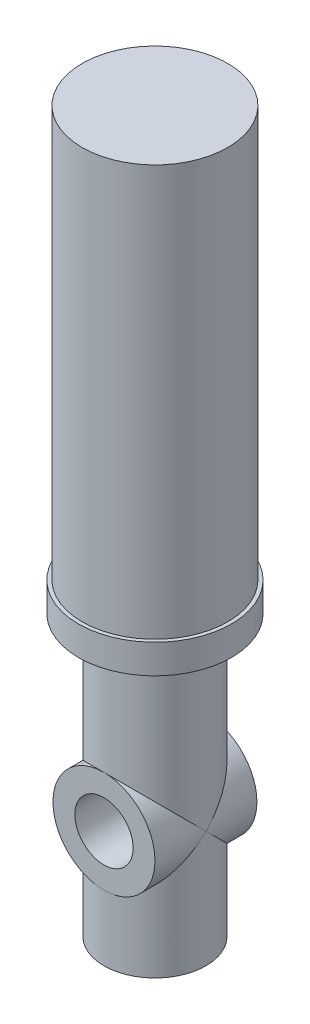
ISO-10303-21;
HEADER;
FILE_DESCRIPTION(('STEP AP214'),'2;1');
FILE_NAME('part.step','',(''),(''),'','','');
FILE_SCHEMA(('AUTOMOTIVE_DESIGN { 1 0 10303 214 1 1 1 1 }'));
ENDSEC;
DATA;
#1=APPLICATION_CONTEXT('core data for automotive mechanical design processes');
#2=APPLICATION_PROTOCOL_DEFINITION('international standard','automotive_design',2000,#1);
#3=PRODUCT_CONTEXT('',#1,'mechanical');
#4=PRODUCT('Part','Part','',(#3));
#5=PRODUCT_RELATED_PRODUCT_CATEGORY('part','',(#4));
#6=PRODUCT_DEFINITION_FORMATION('','',#4);
#7=PRODUCT_DEFINITION_CONTEXT('part definition',#1,'design');
#8=PRODUCT_DEFINITION('design','',#6,#7);
#9=PRODUCT_DEFINITION_SHAPE('','',#8);
#10=(LENGTH_UNIT() NAMED_UNIT(*) SI_UNIT(.MILLI.,.METRE.));
#11=(NAMED_UNIT(*) PLANE_ANGLE_UNIT() SI_UNIT($,.RADIAN.));
#12=(NAMED_UNIT(*) SI_UNIT($,.STERADIAN.) SOLID_ANGLE_UNIT());
#13=UNCERTAINTY_MEASURE_WITH_UNIT(LENGTH_MEASURE(1.E-05),#10,'distance_accuracy_value','');
#14=(GEOMETRIC_REPRESENTATION_CONTEXT(3) GLOBAL_UNCERTAINTY_ASSIGNED_CONTEXT((#13)) GLOBAL_UNIT_ASSIGNED_CONTEXT((#10,
#11,#12)) REPRESENTATION_CONTEXT('',''));
#15=CARTESIAN_POINT('',(0.,0.,0.));
#16=DIRECTION('',(0.,0.,1.));
#17=DIRECTION('',(1.,0.,0.));
#18=AXIS2_PLACEMENT_3D('',#15,#16,#17);
#19=CARTESIAN_POINT('',(0.,132.,0.));
#20=DIRECTION('',(0.,1.,0.));
#21=DIRECTION('',(0.,0.,1.));
#22=AXIS2_PLACEMENT_3D('',#19,#20,#21);
#23=PLANE('',#22);
#24=CARTESIAN_POINT('',(0.,132.,0.));
#25=DIRECTION('',(0.,1.,0.));
#26=DIRECTION('',(0.,0.,1.));
#27=AXIS2_PLACEMENT_3D('',#24,#25,#26);
#28=CIRCLE('',#27,52.5);
#29=CARTESIAN_POINT('',(0.,132.,52.5));
#30=VERTEX_POINT('',#29);
#31=EDGE_CURVE('E94',#30,#30,#28,.T.);
#32=ORIENTED_EDGE('',*,*,#31,.T.);
#33=EDGE_LOOP('',(#32));
#34=FACE_BOUND('',#33,.T.);
#35=CARTESIAN_POINT('',(0.,132.,0.));
#36=DIRECTION('',(0.,1.,0.));
#37=DIRECTION('',(0.,0.,1.));
#38=AXIS2_PLACEMENT_3D('',#35,#36,#37);
#39=CIRCLE('',#38,50.);
#40=CARTESIAN_POINT('',(0.,132.,50.));
#41=VERTEX_POINT('',#40);
#42=EDGE_CURVE('E113',#41,#41,#39,.T.);
#43=ORIENTED_EDGE('',*,*,#42,.F.);
#44=EDGE_LOOP('',(#43));
#45=FACE_BOUND('',#44,.T.);
#46=ADVANCED_FACE('F33',(#34,#45),#23,.T.);
#47=CARTESIAN_POINT('',(0.,-80.,0.));
#48=DIRECTION('',(0.,1.,0.));
#49=DIRECTION('',(0.,0.,1.));
#50=AXIS2_PLACEMENT_3D('',#47,#48,#49);
#51=CYLINDRICAL_SURFACE('',#50,35.);
#52=CARTESIAN_POINT('',(0.,0.,0.));
#53=DIRECTION('',(0.,0.707106781186547,-0.707106781186547));
#54=DIRECTION('',(0.,0.707106781186547,0.707106781186547));
#55=AXIS2_PLACEMENT_3D('',#52,#53,#54);
#56=ELLIPSE('',#55,49.4974746830583,35.);
#57=CARTESIAN_POINT('',(35.,0.,0.));
#58=VERTEX_POINT('',#57);
#59=CARTESIAN_POINT('',(0.,35.,35.));
#60=VERTEX_POINT('',#59);
#61=EDGE_CURVE('E11',#58,#60,#56,.F.);
#62=ORIENTED_EDGE('',*,*,#61,.F.);
#63=CARTESIAN_POINT('',(0.,0.,0.));
#64=DIRECTION('',(0.,0.707106781186547,0.707106781186547));
#65=DIRECTION('',(0.,0.707106781186547,-0.707106781186547));
#66=AXIS2_PLACEMENT_3D('',#63,#64,#65);
#67=ELLIPSE('',#66,49.4974746830583,35.);
#68=CARTESIAN_POINT('',(0.,35.,-35.));
#69=VERTEX_POINT('',#68);
#70=EDGE_CURVE('E57',#69,#58,#67,.F.);
#71=ORIENTED_EDGE('',*,*,#70,.F.);
#72=CARTESIAN_POINT('',(-35.,0.,0.));
#73=VERTEX_POINT('',#72);
#74=EDGE_CURVE('E42',#73,#69,#67,.F.);
#75=ORIENTED_EDGE('',*,*,#74,.F.);
#76=EDGE_CURVE('E44',#60,#73,#56,.F.);
#77=ORIENTED_EDGE('',*,*,#76,.F.);
#78=EDGE_LOOP('',(#62,#71,#75,#77));
#79=FACE_BOUND('',#78,.T.);
#80=CARTESIAN_POINT('',(0.,112.,0.));
#81=DIRECTION('',(0.,1.,0.));
#82=DIRECTION('',(0.,0.,1.));
#83=AXIS2_PLACEMENT_3D('',#80,#81,#82);
#84=CIRCLE('',#83,35.);
#85=CARTESIAN_POINT('',(0.,112.,35.));
#86=VERTEX_POINT('',#85);
#87=EDGE_CURVE('E85',#86,#86,#84,.F.);
#88=ORIENTED_EDGE('',*,*,#87,.T.);
#89=EDGE_LOOP('',(#88));
#90=FACE_BOUND('',#89,.T.);
#91=ADVANCED_FACE('F69',(#79,#90),#51,.T.);
#92=CARTESIAN_POINT('',(0.,0.,0.));
#93=DIRECTION('',(0.,0.707106781186547,0.707106781186547));
#94=DIRECTION('',(0.,0.707106781186547,-0.707106781186547));
#95=AXIS2_PLACEMENT_3D('',#92,#93,#94);
#96=ELLIPSE('',#95,49.4974746830583,35.);
#97=CARTESIAN_POINT('',(0.,-35.,35.));
#98=VERTEX_POINT('',#97);
#99=EDGE_CURVE('E88',#73,#98,#96,.T.);
#100=ORIENTED_EDGE('',*,*,#99,.F.);
#101=CARTESIAN_POINT('',(0.,0.,0.));
#102=DIRECTION('',(0.,0.707106781186547,-0.707106781186547));
#103=DIRECTION('',(0.,0.707106781186547,0.707106781186547));
#104=AXIS2_PLACEMENT_3D('',#101,#102,#103);
#105=ELLIPSE('',#104,49.4974746830583,35.);
#106=CARTESIAN_POINT('',(0.,-35.,-35.));
#107=VERTEX_POINT('',#106);
#108=EDGE_CURVE('E73',#107,#73,#105,.T.);
#109=ORIENTED_EDGE('',*,*,#108,.F.);
#110=EDGE_CURVE('E102',#58,#107,#105,.T.);
#111=ORIENTED_EDGE('',*,*,#110,.F.);
#112=EDGE_CURVE('E81',#98,#58,#96,.T.);
#113=ORIENTED_EDGE('',*,*,#112,.F.);
#114=EDGE_LOOP('',(#100,#109,#111,#113));
#115=FACE_BOUND('',#114,.T.);
#116=CARTESIAN_POINT('',(0.,-80.,0.));
#117=DIRECTION('',(0.,1.,0.));
#118=DIRECTION('',(0.,0.,1.));
#119=AXIS2_PLACEMENT_3D('',#116,#117,#118);
#120=CIRCLE('',#119,35.);
#121=CARTESIAN_POINT('',(0.,-80.,35.));
#122=VERTEX_POINT('',#121);
#123=EDGE_CURVE('E74',#122,#122,#120,.T.);
#124=ORIENTED_EDGE('',*,*,#123,.T.);
#125=EDGE_LOOP('',(#124));
#126=FACE_BOUND('',#125,.T.);
#127=ADVANCED_FACE('F35',(#115,#126),#51,.T.);
#128=CARTESIAN_POINT('',(0.,-80.,0.));
#129=DIRECTION('',(0.,1.,0.));
#130=DIRECTION('',(0.,0.,1.));
#131=AXIS2_PLACEMENT_3D('',#128,#129,#130);
#132=PLANE('',#131);
#133=ORIENTED_EDGE('',*,*,#123,.F.);
#134=EDGE_LOOP('',(#133));
#135=FACE_BOUND('',#134,.T.);
#136=ADVANCED_FACE('F148',(#135),#132,.F.);
#137=CARTESIAN_POINT('',(0.,0.,35.));
#138=DIRECTION('',(0.,0.,1.));
#139=DIRECTION('',(1.,0.,0.));
#140=AXIS2_PLACEMENT_3D('',#137,#138,#139);
#141=PLANE('',#140);
#142=CARTESIAN_POINT('',(0.,0.,35.));
#143=DIRECTION('',(0.,0.,1.));
#144=DIRECTION('',(1.,0.,0.));
#145=AXIS2_PLACEMENT_3D('',#142,#143,#144);
#146=CIRCLE('',#145,20.);
#147=CARTESIAN_POINT('',(20.,0.,35.));
#148=VERTEX_POINT('',#147);
#149=EDGE_CURVE('E116',#148,#148,#146,.T.);
#150=ORIENTED_EDGE('',*,*,#149,.F.);
#151=EDGE_LOOP('',(#150));
#152=FACE_BOUND('',#151,.T.);
#153=CARTESIAN_POINT('',(0.,0.,35.));
#154=DIRECTION('',(0.,0.,1.));
#155=DIRECTION('',(1.,0.,0.));
#156=AXIS2_PLACEMENT_3D('',#153,#154,#155);
#157=CIRCLE('',#156,35.);
#158=EDGE_CURVE('E84',#60,#98,#157,.T.);
#159=ORIENTED_EDGE('',*,*,#158,.T.);
#160=EDGE_CURVE('E79',#98,#60,#157,.T.);
#161=ORIENTED_EDGE('',*,*,#160,.T.);
#162=EDGE_LOOP('',(#159,#161));
#163=FACE_BOUND('',#162,.T.);
#164=ADVANCED_FACE('F83',(#152,#163),#141,.T.);
#165=CARTESIAN_POINT('',(0.,0.,-35.));
#166=DIRECTION('',(0.,0.,1.));
#167=DIRECTION('',(1.,0.,0.));
#168=AXIS2_PLACEMENT_3D('',#165,#166,#167);
#169=CYLINDRICAL_SURFACE('',#168,35.);
#170=ORIENTED_EDGE('',*,*,#76,.T.);
#171=ORIENTED_EDGE('',*,*,#99,.T.);
#172=ORIENTED_EDGE('',*,*,#158,.F.);
#173=EDGE_LOOP('',(#170,#171,#172));
#174=FACE_BOUND('',#173,.T.);
#175=ADVANCED_FACE('F87',(#174),#169,.T.);
#176=ORIENTED_EDGE('',*,*,#160,.F.);
#177=ORIENTED_EDGE('',*,*,#112,.T.);
#178=ORIENTED_EDGE('',*,*,#61,.T.);
#179=EDGE_LOOP('',(#176,#177,#178));
#180=FACE_BOUND('',#179,.T.);
#181=ADVANCED_FACE('F78',(#180),#169,.T.);
#182=CARTESIAN_POINT('',(0.,0.,-35.));
#183=DIRECTION('',(0.,0.,1.));
#184=DIRECTION('',(1.,0.,0.));
#185=AXIS2_PLACEMENT_3D('',#182,#183,#184);
#186=CIRCLE('',#185,35.);
#187=EDGE_CURVE('E89',#107,#69,#186,.T.);
#188=ORIENTED_EDGE('',*,*,#187,.T.);
#189=ORIENTED_EDGE('',*,*,#70,.T.);
#190=ORIENTED_EDGE('',*,*,#110,.T.);
#191=EDGE_LOOP('',(#188,#189,#190));
#192=FACE_BOUND('',#191,.T.);
#193=ADVANCED_FACE('F167',(#192),#169,.T.);
#194=CARTESIAN_POINT('',(0.,0.,-35.));
#195=DIRECTION('',(0.,0.,1.));
#196=DIRECTION('',(1.,0.,0.));
#197=AXIS2_PLACEMENT_3D('',#194,#195,#196);
#198=PLANE('',#197);
#199=CARTESIAN_POINT('',(0.,0.,-35.));
#200=DIRECTION('',(0.,0.,1.));
#201=DIRECTION('',(1.,0.,0.));
#202=AXIS2_PLACEMENT_3D('',#199,#200,#201);
#203=CIRCLE('',#202,20.);
#204=CARTESIAN_POINT('',(20.,0.,-35.));
#205=VERTEX_POINT('',#204);
#206=EDGE_CURVE('E37',#205,#205,#203,.T.);
#207=ORIENTED_EDGE('',*,*,#206,.T.);
#208=EDGE_LOOP('',(#207));
#209=FACE_BOUND('',#208,.T.);
#210=EDGE_CURVE('E91',#69,#107,#186,.T.);
#211=ORIENTED_EDGE('',*,*,#210,.F.);
#212=ORIENTED_EDGE('',*,*,#187,.F.);
#213=EDGE_LOOP('',(#211,#212));
#214=FACE_BOUND('',#213,.T.);
#215=ADVANCED_FACE('F125',(#209,#214),#198,.F.);
#216=ORIENTED_EDGE('',*,*,#108,.T.);
#217=ORIENTED_EDGE('',*,*,#74,.T.);
#218=ORIENTED_EDGE('',*,*,#210,.T.);
#219=EDGE_LOOP('',(#216,#217,#218));
#220=FACE_BOUND('',#219,.T.);
#221=ADVANCED_FACE('F146',(#220),#169,.T.);
#222=CARTESIAN_POINT('',(0.,112.,0.));
#223=DIRECTION('',(0.,1.,0.));
#224=DIRECTION('',(0.,0.,1.));
#225=AXIS2_PLACEMENT_3D('',#222,#223,#224);
#226=CYLINDRICAL_SURFACE('',#225,52.5);
#227=CARTESIAN_POINT('',(0.,112.,0.));
#228=DIRECTION('',(0.,1.,0.));
#229=DIRECTION('',(0.,0.,1.));
#230=AXIS2_PLACEMENT_3D('',#227,#228,#229);
#231=CIRCLE('',#230,52.5);
#232=CARTESIAN_POINT('',(0.,112.,52.5));
#233=VERTEX_POINT('',#232);
#234=EDGE_CURVE('E105',#233,#233,#231,.T.);
#235=ORIENTED_EDGE('',*,*,#234,.T.);
#236=EDGE_LOOP('',(#235));
#237=FACE_BOUND('',#236,.T.);
#238=ORIENTED_EDGE('',*,*,#31,.F.);
#239=EDGE_LOOP('',(#238));
#240=FACE_BOUND('',#239,.T.);
#241=ADVANCED_FACE('F175',(#237,#240),#226,.T.);
#242=CARTESIAN_POINT('',(0.,112.,0.));
#243=DIRECTION('',(0.,1.,0.));
#244=DIRECTION('',(0.,0.,1.));
#245=AXIS2_PLACEMENT_3D('',#242,#243,#244);
#246=PLANE('',#245);
#247=ORIENTED_EDGE('',*,*,#87,.F.);
#248=EDGE_LOOP('',(#247));
#249=FACE_BOUND('',#248,.T.);
#250=ORIENTED_EDGE('',*,*,#234,.F.);
#251=EDGE_LOOP('',(#250));
#252=FACE_BOUND('',#251,.T.);
#253=ADVANCED_FACE('F179',(#249,#252),#246,.F.);
#254=CARTESIAN_POINT('',(0.,414.,0.));
#255=DIRECTION('',(0.,-1.,0.));
#256=DIRECTION('',(0.,0.,-1.));
#257=AXIS2_PLACEMENT_3D('',#254,#255,#256);
#258=CYLINDRICAL_SURFACE('',#257,50.);
#259=CARTESIAN_POINT('',(0.,414.,0.));
#260=DIRECTION('',(0.,1.,0.));
#261=DIRECTION('',(0.,0.,1.));
#262=AXIS2_PLACEMENT_3D('',#259,#260,#261);
#263=CIRCLE('',#262,50.);
#264=CARTESIAN_POINT('',(0.,414.,50.));
#265=VERTEX_POINT('',#264);
#266=EDGE_CURVE('E111',#265,#265,#263,.T.);
#267=ORIENTED_EDGE('',*,*,#266,.F.);
#268=EDGE_LOOP('',(#267));
#269=FACE_BOUND('',#268,.T.);
#270=ORIENTED_EDGE('',*,*,#42,.T.);
#271=EDGE_LOOP('',(#270));
#272=FACE_BOUND('',#271,.T.);
#273=ADVANCED_FACE('F135',(#269,#272),#258,.T.);
#274=CARTESIAN_POINT('',(0.,414.,0.));
#275=DIRECTION('',(0.,1.,0.));
#276=DIRECTION('',(0.,0.,1.));
#277=AXIS2_PLACEMENT_3D('',#274,#275,#276);
#278=PLANE('',#277);
#279=ORIENTED_EDGE('',*,*,#266,.T.);
#280=EDGE_LOOP('',(#279));
#281=FACE_BOUND('',#280,.T.);
#282=ADVANCED_FACE('F130',(#281),#278,.T.);
#283=CARTESIAN_POINT('',(0.,0.,-52.5));
#284=DIRECTION('',(0.,0.,1.));
#285=DIRECTION('',(1.,0.,0.));
#286=AXIS2_PLACEMENT_3D('',#283,#284,#285);
#287=CYLINDRICAL_SURFACE('',#286,20.);
#288=ORIENTED_EDGE('',*,*,#149,.T.);
#289=EDGE_LOOP('',(#288));
#290=FACE_BOUND('',#289,.T.);
#291=ORIENTED_EDGE('',*,*,#206,.F.);
#292=EDGE_LOOP('',(#291));
#293=FACE_BOUND('',#292,.T.);
#294=ADVANCED_FACE('F128',(#290,#293),#287,.F.);
#295=CLOSED_SHELL('',(#46,#91,#127,#136,#164,#175,#181,#193,#215,#221,#241,#253,#273,#282,#294));
#296=MANIFOLD_SOLID_BREP('B2',#295);
#297=ADVANCED_BREP_SHAPE_REPRESENTATION('',(#18,#296),#14);
#298=SHAPE_DEFINITION_REPRESENTATION(#9,#297);
ENDSEC;
END-ISO-10303-21;
